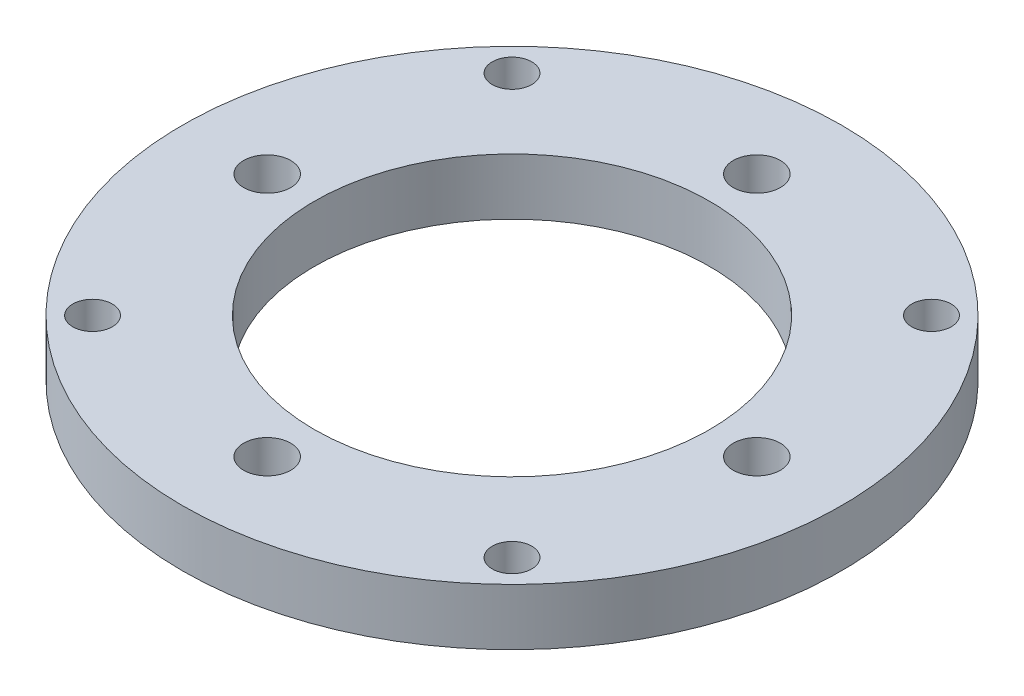
ISO-10303-21;
HEADER;
FILE_DESCRIPTION(('STEP AP214'),'2;1');
FILE_NAME('part.step','',(''),(''),'','','');
FILE_SCHEMA(('AUTOMOTIVE_DESIGN { 1 0 10303 214 1 1 1 1 }'));
ENDSEC;
DATA;
#1=APPLICATION_CONTEXT('core data for automotive mechanical design processes');
#2=APPLICATION_PROTOCOL_DEFINITION('international standard','automotive_design',2000,#1);
#3=PRODUCT_CONTEXT('',#1,'mechanical');
#4=PRODUCT('Part','Part','',(#3));
#5=PRODUCT_RELATED_PRODUCT_CATEGORY('part','',(#4));
#6=PRODUCT_DEFINITION_FORMATION('','',#4);
#7=PRODUCT_DEFINITION_CONTEXT('part definition',#1,'design');
#8=PRODUCT_DEFINITION('design','',#6,#7);
#9=PRODUCT_DEFINITION_SHAPE('','',#8);
#10=(LENGTH_UNIT() NAMED_UNIT(*) SI_UNIT(.MILLI.,.METRE.));
#11=(NAMED_UNIT(*) PLANE_ANGLE_UNIT() SI_UNIT($,.RADIAN.));
#12=(NAMED_UNIT(*) SI_UNIT($,.STERADIAN.) SOLID_ANGLE_UNIT());
#13=UNCERTAINTY_MEASURE_WITH_UNIT(LENGTH_MEASURE(1.E-05),#10,'distance_accuracy_value','');
#14=(GEOMETRIC_REPRESENTATION_CONTEXT(3) GLOBAL_UNCERTAINTY_ASSIGNED_CONTEXT((#13)) GLOBAL_UNIT_ASSIGNED_CONTEXT((#10,
#11,#12)) REPRESENTATION_CONTEXT('',''));
#15=CARTESIAN_POINT('',(0.,0.,0.));
#16=DIRECTION('',(0.,0.,1.));
#17=DIRECTION('',(1.,0.,0.));
#18=AXIS2_PLACEMENT_3D('',#15,#16,#17);
#19=CARTESIAN_POINT('',(0.,6.,0.));
#20=DIRECTION('',(0.,-1.,0.));
#21=DIRECTION('',(0.,0.,-1.));
#22=AXIS2_PLACEMENT_3D('',#19,#20,#21);
#23=CYLINDRICAL_SURFACE('',#22,35.);
#24=CARTESIAN_POINT('',(0.,6.,0.));
#25=DIRECTION('',(0.,1.,0.));
#26=DIRECTION('',(0.,0.,1.));
#27=AXIS2_PLACEMENT_3D('',#24,#25,#26);
#28=CIRCLE('',#27,35.);
#29=CARTESIAN_POINT('',(0.,6.,35.));
#30=VERTEX_POINT('',#29);
#31=EDGE_CURVE('E63',#30,#30,#28,.T.);
#32=ORIENTED_EDGE('',*,*,#31,.F.);
#33=EDGE_LOOP('',(#32));
#34=FACE_BOUND('',#33,.T.);
#35=CARTESIAN_POINT('',(0.,0.,0.));
#36=DIRECTION('',(0.,1.,0.));
#37=DIRECTION('',(0.,0.,1.));
#38=AXIS2_PLACEMENT_3D('',#35,#36,#37);
#39=CIRCLE('',#38,35.);
#40=CARTESIAN_POINT('',(0.,0.,35.));
#41=VERTEX_POINT('',#40);
#42=EDGE_CURVE('E84',#41,#41,#39,.T.);
#43=ORIENTED_EDGE('',*,*,#42,.T.);
#44=EDGE_LOOP('',(#43));
#45=FACE_BOUND('',#44,.T.);
#46=ADVANCED_FACE('F31',(#34,#45),#23,.T.);
#47=CARTESIAN_POINT('',(0.,6.,0.));
#48=DIRECTION('',(0.,1.,0.));
#49=DIRECTION('',(0.,0.,1.));
#50=AXIS2_PLACEMENT_3D('',#47,#48,#49);
#51=PLANE('',#50);
#52=CARTESIAN_POINT('',(22.2738636073761,6.,-22.2738636073764));
#53=DIRECTION('',(0.,1.,0.));
#54=DIRECTION('',(0.,0.,1.));
#55=AXIS2_PLACEMENT_3D('',#52,#53,#54);
#56=CIRCLE('',#55,2.1);
#57=CARTESIAN_POINT('',(22.2738636073761,6.,-20.1738636073764));
#58=VERTEX_POINT('',#57);
#59=EDGE_CURVE('E68',#58,#58,#56,.T.);
#60=ORIENTED_EDGE('',*,*,#59,.F.);
#61=EDGE_LOOP('',(#60));
#62=FACE_BOUND('',#61,.T.);
#63=CARTESIAN_POINT('',(22.2738636073764,6.,22.2738636073761));
#64=DIRECTION('',(0.,1.,0.));
#65=DIRECTION('',(0.,0.,1.));
#66=AXIS2_PLACEMENT_3D('',#63,#64,#65);
#67=CIRCLE('',#66,2.1);
#68=CARTESIAN_POINT('',(22.2738636073764,6.,24.3738636073761));
#69=VERTEX_POINT('',#68);
#70=EDGE_CURVE('E67',#69,#69,#67,.T.);
#71=ORIENTED_EDGE('',*,*,#70,.F.);
#72=EDGE_LOOP('',(#71));
#73=FACE_BOUND('',#72,.T.);
#74=CARTESIAN_POINT('',(-22.2738636073761,6.,22.2738636073764));
#75=DIRECTION('',(0.,1.,0.));
#76=DIRECTION('',(0.,0.,1.));
#77=AXIS2_PLACEMENT_3D('',#74,#75,#76);
#78=CIRCLE('',#77,2.1);
#79=CARTESIAN_POINT('',(-22.2738636073761,6.,24.3738636073764));
#80=VERTEX_POINT('',#79);
#81=EDGE_CURVE('E72',#80,#80,#78,.T.);
#82=ORIENTED_EDGE('',*,*,#81,.F.);
#83=EDGE_LOOP('',(#82));
#84=FACE_BOUND('',#83,.T.);
#85=CARTESIAN_POINT('',(-22.2738636073764,6.,-22.2738636073761));
#86=DIRECTION('',(0.,1.,0.));
#87=DIRECTION('',(0.,0.,1.));
#88=AXIS2_PLACEMENT_3D('',#85,#86,#87);
#89=CIRCLE('',#88,2.1);
#90=CARTESIAN_POINT('',(-22.2738636073764,6.,-20.1738636073761));
#91=VERTEX_POINT('',#90);
#92=EDGE_CURVE('E76',#91,#91,#89,.T.);
#93=ORIENTED_EDGE('',*,*,#92,.F.);
#94=EDGE_LOOP('',(#93));
#95=FACE_BOUND('',#94,.T.);
#96=CARTESIAN_POINT('',(-26.,6.,0.));
#97=DIRECTION('',(0.,1.,0.));
#98=DIRECTION('',(0.,0.,1.));
#99=AXIS2_PLACEMENT_3D('',#96,#97,#98);
#100=CIRCLE('',#99,2.5);
#101=CARTESIAN_POINT('',(-26.,6.,2.5));
#102=VERTEX_POINT('',#101);
#103=EDGE_CURVE('E80',#102,#102,#100,.T.);
#104=ORIENTED_EDGE('',*,*,#103,.F.);
#105=EDGE_LOOP('',(#104));
#106=FACE_BOUND('',#105,.T.);
#107=CARTESIAN_POINT('',(26.,6.,0.));
#108=DIRECTION('',(0.,1.,0.));
#109=DIRECTION('',(0.,0.,1.));
#110=AXIS2_PLACEMENT_3D('',#107,#108,#109);
#111=CIRCLE('',#110,2.5);
#112=CARTESIAN_POINT('',(26.,6.,2.5));
#113=VERTEX_POINT('',#112);
#114=EDGE_CURVE('E98',#113,#113,#111,.T.);
#115=ORIENTED_EDGE('',*,*,#114,.F.);
#116=EDGE_LOOP('',(#115));
#117=FACE_BOUND('',#116,.T.);
#118=CARTESIAN_POINT('',(0.,6.,26.));
#119=DIRECTION('',(0.,1.,0.));
#120=DIRECTION('',(0.,0.,1.));
#121=AXIS2_PLACEMENT_3D('',#118,#119,#120);
#122=CIRCLE('',#121,2.5);
#123=CARTESIAN_POINT('',(0.,6.,28.5));
#124=VERTEX_POINT('',#123);
#125=EDGE_CURVE('E95',#124,#124,#122,.T.);
#126=ORIENTED_EDGE('',*,*,#125,.F.);
#127=EDGE_LOOP('',(#126));
#128=FACE_BOUND('',#127,.T.);
#129=CARTESIAN_POINT('',(0.,6.,-26.));
#130=DIRECTION('',(0.,1.,0.));
#131=DIRECTION('',(0.,0.,1.));
#132=AXIS2_PLACEMENT_3D('',#129,#130,#131);
#133=CIRCLE('',#132,2.5);
#134=CARTESIAN_POINT('',(0.,6.,-23.5));
#135=VERTEX_POINT('',#134);
#136=EDGE_CURVE('E92',#135,#135,#133,.T.);
#137=ORIENTED_EDGE('',*,*,#136,.F.);
#138=EDGE_LOOP('',(#137));
#139=FACE_BOUND('',#138,.T.);
#140=CARTESIAN_POINT('',(0.,6.,0.));
#141=DIRECTION('',(0.,1.,0.));
#142=DIRECTION('',(0.,0.,1.));
#143=AXIS2_PLACEMENT_3D('',#140,#141,#142);
#144=CIRCLE('',#143,21.);
#145=CARTESIAN_POINT('',(0.,6.,21.));
#146=VERTEX_POINT('',#145);
#147=EDGE_CURVE('E85',#146,#146,#144,.T.);
#148=ORIENTED_EDGE('',*,*,#147,.F.);
#149=EDGE_LOOP('',(#148));
#150=FACE_BOUND('',#149,.T.);
#151=ORIENTED_EDGE('',*,*,#31,.T.);
#152=EDGE_LOOP('',(#151));
#153=FACE_BOUND('',#152,.T.);
#154=ADVANCED_FACE('F115',(#62,#73,#84,#95,#106,#117,#128,#139,#150,#153),#51,.T.);
#155=CARTESIAN_POINT('',(0.,0.,0.));
#156=DIRECTION('',(0.,1.,0.));
#157=DIRECTION('',(0.,0.,1.));
#158=AXIS2_PLACEMENT_3D('',#155,#156,#157);
#159=PLANE('',#158);
#160=CARTESIAN_POINT('',(-26.,0.,0.));
#161=DIRECTION('',(0.,1.,0.));
#162=DIRECTION('',(0.,0.,1.));
#163=AXIS2_PLACEMENT_3D('',#160,#161,#162);
#164=CIRCLE('',#163,4.5);
#165=CARTESIAN_POINT('',(-26.,0.,4.5));
#166=VERTEX_POINT('',#165);
#167=EDGE_CURVE('E51',#166,#166,#164,.T.);
#168=ORIENTED_EDGE('',*,*,#167,.T.);
#169=EDGE_LOOP('',(#168));
#170=FACE_BOUND('',#169,.T.);
#171=CARTESIAN_POINT('',(0.,0.,-26.));
#172=DIRECTION('',(0.,1.,0.));
#173=DIRECTION('',(0.,0.,1.));
#174=AXIS2_PLACEMENT_3D('',#171,#172,#173);
#175=CIRCLE('',#174,4.5);
#176=CARTESIAN_POINT('',(0.,0.,-21.5));
#177=VERTEX_POINT('',#176);
#178=EDGE_CURVE('E54',#177,#177,#175,.T.);
#179=ORIENTED_EDGE('',*,*,#178,.T.);
#180=EDGE_LOOP('',(#179));
#181=FACE_BOUND('',#180,.T.);
#182=CARTESIAN_POINT('',(26.,0.,0.));
#183=DIRECTION('',(0.,1.,0.));
#184=DIRECTION('',(0.,0.,1.));
#185=AXIS2_PLACEMENT_3D('',#182,#183,#184);
#186=CIRCLE('',#185,4.5);
#187=CARTESIAN_POINT('',(26.,0.,4.5));
#188=VERTEX_POINT('',#187);
#189=EDGE_CURVE('E57',#188,#188,#186,.T.);
#190=ORIENTED_EDGE('',*,*,#189,.T.);
#191=EDGE_LOOP('',(#190));
#192=FACE_BOUND('',#191,.T.);
#193=CARTESIAN_POINT('',(0.,0.,26.));
#194=DIRECTION('',(0.,1.,0.));
#195=DIRECTION('',(0.,0.,1.));
#196=AXIS2_PLACEMENT_3D('',#193,#194,#195);
#197=CIRCLE('',#196,4.5);
#198=CARTESIAN_POINT('',(0.,0.,30.5));
#199=VERTEX_POINT('',#198);
#200=EDGE_CURVE('E60',#199,#199,#197,.T.);
#201=ORIENTED_EDGE('',*,*,#200,.T.);
#202=EDGE_LOOP('',(#201));
#203=FACE_BOUND('',#202,.T.);
#204=CARTESIAN_POINT('',(22.2738636073761,0.,-22.2738636073764));
#205=DIRECTION('',(0.,1.,0.));
#206=DIRECTION('',(0.,0.,1.));
#207=AXIS2_PLACEMENT_3D('',#204,#205,#206);
#208=CIRCLE('',#207,2.1);
#209=CARTESIAN_POINT('',(22.2738636073761,0.,-20.1738636073764));
#210=VERTEX_POINT('',#209);
#211=EDGE_CURVE('E64',#210,#210,#208,.T.);
#212=ORIENTED_EDGE('',*,*,#211,.T.);
#213=EDGE_LOOP('',(#212));
#214=FACE_BOUND('',#213,.T.);
#215=CARTESIAN_POINT('',(22.2738636073764,0.,22.2738636073761));
#216=DIRECTION('',(0.,1.,0.));
#217=DIRECTION('',(0.,0.,1.));
#218=AXIS2_PLACEMENT_3D('',#215,#216,#217);
#219=CIRCLE('',#218,2.1);
#220=CARTESIAN_POINT('',(22.2738636073764,0.,24.3738636073761));
#221=VERTEX_POINT('',#220);
#222=EDGE_CURVE('E69',#221,#221,#219,.T.);
#223=ORIENTED_EDGE('',*,*,#222,.T.);
#224=EDGE_LOOP('',(#223));
#225=FACE_BOUND('',#224,.T.);
#226=CARTESIAN_POINT('',(-22.2738636073761,0.,22.2738636073764));
#227=DIRECTION('',(0.,1.,0.));
#228=DIRECTION('',(0.,0.,1.));
#229=AXIS2_PLACEMENT_3D('',#226,#227,#228);
#230=CIRCLE('',#229,2.1);
#231=CARTESIAN_POINT('',(-22.2738636073761,0.,24.3738636073764));
#232=VERTEX_POINT('',#231);
#233=EDGE_CURVE('E73',#232,#232,#230,.T.);
#234=ORIENTED_EDGE('',*,*,#233,.T.);
#235=EDGE_LOOP('',(#234));
#236=FACE_BOUND('',#235,.T.);
#237=CARTESIAN_POINT('',(-22.2738636073764,0.,-22.2738636073761));
#238=DIRECTION('',(0.,1.,0.));
#239=DIRECTION('',(0.,0.,1.));
#240=AXIS2_PLACEMENT_3D('',#237,#238,#239);
#241=CIRCLE('',#240,2.1);
#242=CARTESIAN_POINT('',(-22.2738636073764,0.,-20.1738636073761));
#243=VERTEX_POINT('',#242);
#244=EDGE_CURVE('E77',#243,#243,#241,.T.);
#245=ORIENTED_EDGE('',*,*,#244,.T.);
#246=EDGE_LOOP('',(#245));
#247=FACE_BOUND('',#246,.T.);
#248=CARTESIAN_POINT('',(0.,0.,0.));
#249=DIRECTION('',(0.,1.,0.));
#250=DIRECTION('',(0.,0.,1.));
#251=AXIS2_PLACEMENT_3D('',#248,#249,#250);
#252=CIRCLE('',#251,21.);
#253=CARTESIAN_POINT('',(0.,0.,21.));
#254=VERTEX_POINT('',#253);
#255=EDGE_CURVE('E81',#254,#254,#252,.T.);
#256=ORIENTED_EDGE('',*,*,#255,.T.);
#257=EDGE_LOOP('',(#256));
#258=FACE_BOUND('',#257,.T.);
#259=ORIENTED_EDGE('',*,*,#42,.F.);
#260=EDGE_LOOP('',(#259));
#261=FACE_BOUND('',#260,.T.);
#262=ADVANCED_FACE('F118',(#170,#181,#192,#203,#214,#225,#236,#247,#258,#261),#159,.F.);
#263=CARTESIAN_POINT('',(0.,-4.,0.));
#264=DIRECTION('',(0.,1.,0.));
#265=DIRECTION('',(0.,0.,1.));
#266=AXIS2_PLACEMENT_3D('',#263,#264,#265);
#267=CYLINDRICAL_SURFACE('',#266,21.);
#268=ORIENTED_EDGE('',*,*,#147,.T.);
#269=EDGE_LOOP('',(#268));
#270=FACE_BOUND('',#269,.T.);
#271=ORIENTED_EDGE('',*,*,#255,.F.);
#272=EDGE_LOOP('',(#271));
#273=FACE_BOUND('',#272,.T.);
#274=ADVANCED_FACE('F144',(#270,#273),#267,.F.);
#275=CARTESIAN_POINT('',(0.,-4.,-26.));
#276=DIRECTION('',(0.,1.,0.));
#277=DIRECTION('',(0.,0.,1.));
#278=AXIS2_PLACEMENT_3D('',#275,#276,#277);
#279=CYLINDRICAL_SURFACE('',#278,2.5);
#280=CARTESIAN_POINT('',(0.,2.00000000000001,-26.));
#281=DIRECTION('',(0.,1.,0.));
#282=DIRECTION('',(0.,0.,1.));
#283=AXIS2_PLACEMENT_3D('',#280,#281,#282);
#284=CIRCLE('',#283,2.5);
#285=CARTESIAN_POINT('',(0.,2.00000000000001,-23.5));
#286=VERTEX_POINT('',#285);
#287=EDGE_CURVE('E42',#286,#286,#284,.F.);
#288=ORIENTED_EDGE('',*,*,#287,.T.);
#289=EDGE_LOOP('',(#288));
#290=FACE_BOUND('',#289,.T.);
#291=ORIENTED_EDGE('',*,*,#136,.T.);
#292=EDGE_LOOP('',(#291));
#293=FACE_BOUND('',#292,.T.);
#294=ADVANCED_FACE('F152',(#290,#293),#279,.F.);
#295=CARTESIAN_POINT('',(0.,-4.,26.));
#296=DIRECTION('',(0.,1.,0.));
#297=DIRECTION('',(0.,0.,1.));
#298=AXIS2_PLACEMENT_3D('',#295,#296,#297);
#299=CYLINDRICAL_SURFACE('',#298,2.5);
#300=CARTESIAN_POINT('',(0.,2.00000000000001,26.));
#301=DIRECTION('',(0.,1.,0.));
#302=DIRECTION('',(0.,0.,1.));
#303=AXIS2_PLACEMENT_3D('',#300,#301,#302);
#304=CIRCLE('',#303,2.5);
#305=CARTESIAN_POINT('',(0.,2.00000000000001,28.5));
#306=VERTEX_POINT('',#305);
#307=EDGE_CURVE('E10',#306,#306,#304,.F.);
#308=ORIENTED_EDGE('',*,*,#307,.T.);
#309=EDGE_LOOP('',(#308));
#310=FACE_BOUND('',#309,.T.);
#311=ORIENTED_EDGE('',*,*,#125,.T.);
#312=EDGE_LOOP('',(#311));
#313=FACE_BOUND('',#312,.T.);
#314=ADVANCED_FACE('F209',(#310,#313),#299,.F.);
#315=CARTESIAN_POINT('',(26.,-4.,0.));
#316=DIRECTION('',(0.,1.,0.));
#317=DIRECTION('',(0.,0.,1.));
#318=AXIS2_PLACEMENT_3D('',#315,#316,#317);
#319=CYLINDRICAL_SURFACE('',#318,2.5);
#320=CARTESIAN_POINT('',(26.,2.00000000000001,0.));
#321=DIRECTION('',(0.,1.,0.));
#322=DIRECTION('',(0.,0.,1.));
#323=AXIS2_PLACEMENT_3D('',#320,#321,#322);
#324=CIRCLE('',#323,2.5);
#325=CARTESIAN_POINT('',(26.,2.00000000000001,2.5));
#326=VERTEX_POINT('',#325);
#327=EDGE_CURVE('E38',#326,#326,#324,.F.);
#328=ORIENTED_EDGE('',*,*,#327,.T.);
#329=EDGE_LOOP('',(#328));
#330=FACE_BOUND('',#329,.T.);
#331=ORIENTED_EDGE('',*,*,#114,.T.);
#332=EDGE_LOOP('',(#331));
#333=FACE_BOUND('',#332,.T.);
#334=ADVANCED_FACE('F202',(#330,#333),#319,.F.);
#335=CARTESIAN_POINT('',(-26.,-4.,0.));
#336=DIRECTION('',(0.,1.,0.));
#337=DIRECTION('',(0.,0.,1.));
#338=AXIS2_PLACEMENT_3D('',#335,#336,#337);
#339=CYLINDRICAL_SURFACE('',#338,2.5);
#340=CARTESIAN_POINT('',(-26.,2.00000000000001,0.));
#341=DIRECTION('',(0.,1.,0.));
#342=DIRECTION('',(0.,0.,1.));
#343=AXIS2_PLACEMENT_3D('',#340,#341,#342);
#344=CIRCLE('',#343,2.5);
#345=CARTESIAN_POINT('',(-26.,2.00000000000001,2.5));
#346=VERTEX_POINT('',#345);
#347=EDGE_CURVE('E46',#346,#346,#344,.F.);
#348=ORIENTED_EDGE('',*,*,#347,.T.);
#349=EDGE_LOOP('',(#348));
#350=FACE_BOUND('',#349,.T.);
#351=ORIENTED_EDGE('',*,*,#103,.T.);
#352=EDGE_LOOP('',(#351));
#353=FACE_BOUND('',#352,.T.);
#354=ADVANCED_FACE('F191',(#350,#353),#339,.F.);
#355=CARTESIAN_POINT('',(-22.2738636073764,-4.,-22.2738636073761));
#356=DIRECTION('',(0.,1.,0.));
#357=DIRECTION('',(0.,0.,1.));
#358=AXIS2_PLACEMENT_3D('',#355,#356,#357);
#359=CYLINDRICAL_SURFACE('',#358,2.1);
#360=ORIENTED_EDGE('',*,*,#92,.T.);
#361=EDGE_LOOP('',(#360));
#362=FACE_BOUND('',#361,.T.);
#363=ORIENTED_EDGE('',*,*,#244,.F.);
#364=EDGE_LOOP('',(#363));
#365=FACE_BOUND('',#364,.T.);
#366=ADVANCED_FACE('F188',(#362,#365),#359,.F.);
#367=CARTESIAN_POINT('',(-22.2738636073761,-4.,22.2738636073764));
#368=DIRECTION('',(0.,1.,0.));
#369=DIRECTION('',(0.,0.,1.));
#370=AXIS2_PLACEMENT_3D('',#367,#368,#369);
#371=CYLINDRICAL_SURFACE('',#370,2.1);
#372=ORIENTED_EDGE('',*,*,#81,.T.);
#373=EDGE_LOOP('',(#372));
#374=FACE_BOUND('',#373,.T.);
#375=ORIENTED_EDGE('',*,*,#233,.F.);
#376=EDGE_LOOP('',(#375));
#377=FACE_BOUND('',#376,.T.);
#378=ADVANCED_FACE('F190',(#374,#377),#371,.F.);
#379=CARTESIAN_POINT('',(22.2738636073764,-4.,22.2738636073761));
#380=DIRECTION('',(0.,1.,0.));
#381=DIRECTION('',(0.,0.,1.));
#382=AXIS2_PLACEMENT_3D('',#379,#380,#381);
#383=CYLINDRICAL_SURFACE('',#382,2.1);
#384=ORIENTED_EDGE('',*,*,#70,.T.);
#385=EDGE_LOOP('',(#384));
#386=FACE_BOUND('',#385,.T.);
#387=ORIENTED_EDGE('',*,*,#222,.F.);
#388=EDGE_LOOP('',(#387));
#389=FACE_BOUND('',#388,.T.);
#390=ADVANCED_FACE('F198',(#386,#389),#383,.F.);
#391=CARTESIAN_POINT('',(22.2738636073761,-4.,-22.2738636073764));
#392=DIRECTION('',(0.,1.,0.));
#393=DIRECTION('',(0.,0.,1.));
#394=AXIS2_PLACEMENT_3D('',#391,#392,#393);
#395=CYLINDRICAL_SURFACE('',#394,2.1);
#396=ORIENTED_EDGE('',*,*,#59,.T.);
#397=EDGE_LOOP('',(#396));
#398=FACE_BOUND('',#397,.T.);
#399=ORIENTED_EDGE('',*,*,#211,.F.);
#400=EDGE_LOOP('',(#399));
#401=FACE_BOUND('',#400,.T.);
#402=ADVANCED_FACE('F112',(#398,#401),#395,.F.);
#403=CARTESIAN_POINT('',(-26.,0.,0.));
#404=DIRECTION('',(0.,-1.,0.));
#405=DIRECTION('',(0.,0.,-1.));
#406=AXIS2_PLACEMENT_3D('',#403,#404,#405);
#407=CONICAL_SURFACE('',#406,4.5,0.785398163397447);
#408=ORIENTED_EDGE('',*,*,#347,.F.);
#409=EDGE_LOOP('',(#408));
#410=FACE_BOUND('',#409,.T.);
#411=ORIENTED_EDGE('',*,*,#167,.F.);
#412=EDGE_LOOP('',(#411));
#413=FACE_BOUND('',#412,.T.);
#414=ADVANCED_FACE('F157',(#410,#413),#407,.F.);
#415=CARTESIAN_POINT('',(0.,0.,-26.));
#416=DIRECTION('',(0.,-1.,0.));
#417=DIRECTION('',(0.,0.,-1.));
#418=AXIS2_PLACEMENT_3D('',#415,#416,#417);
#419=CONICAL_SURFACE('',#418,4.5,0.785398163397447);
#420=ORIENTED_EDGE('',*,*,#287,.F.);
#421=EDGE_LOOP('',(#420));
#422=FACE_BOUND('',#421,.T.);
#423=ORIENTED_EDGE('',*,*,#178,.F.);
#424=EDGE_LOOP('',(#423));
#425=FACE_BOUND('',#424,.T.);
#426=ADVANCED_FACE('F160',(#422,#425),#419,.F.);
#427=CARTESIAN_POINT('',(26.,0.,0.));
#428=DIRECTION('',(0.,-1.,0.));
#429=DIRECTION('',(0.,0.,-1.));
#430=AXIS2_PLACEMENT_3D('',#427,#428,#429);
#431=CONICAL_SURFACE('',#430,4.5,0.785398163397447);
#432=ORIENTED_EDGE('',*,*,#327,.F.);
#433=EDGE_LOOP('',(#432));
#434=FACE_BOUND('',#433,.T.);
#435=ORIENTED_EDGE('',*,*,#189,.F.);
#436=EDGE_LOOP('',(#435));
#437=FACE_BOUND('',#436,.T.);
#438=ADVANCED_FACE('F163',(#434,#437),#431,.F.);
#439=CARTESIAN_POINT('',(0.,0.,26.));
#440=DIRECTION('',(0.,-1.,0.));
#441=DIRECTION('',(0.,0.,-1.));
#442=AXIS2_PLACEMENT_3D('',#439,#440,#441);
#443=CONICAL_SURFACE('',#442,4.5,0.785398163397447);
#444=ORIENTED_EDGE('',*,*,#307,.F.);
#445=EDGE_LOOP('',(#444));
#446=FACE_BOUND('',#445,.T.);
#447=ORIENTED_EDGE('',*,*,#200,.F.);
#448=EDGE_LOOP('',(#447));
#449=FACE_BOUND('',#448,.T.);
#450=ADVANCED_FACE('F33',(#446,#449),#443,.F.);
#451=CLOSED_SHELL('',(#46,#154,#262,#274,#294,#314,#334,#354,#366,#378,#390,#402,#414,#426,#438,#450));
#452=MANIFOLD_SOLID_BREP('B2',#451);
#453=ADVANCED_BREP_SHAPE_REPRESENTATION('',(#18,#452),#14);
#454=SHAPE_DEFINITION_REPRESENTATION(#9,#453);
ENDSEC;
END-ISO-10303-21;
